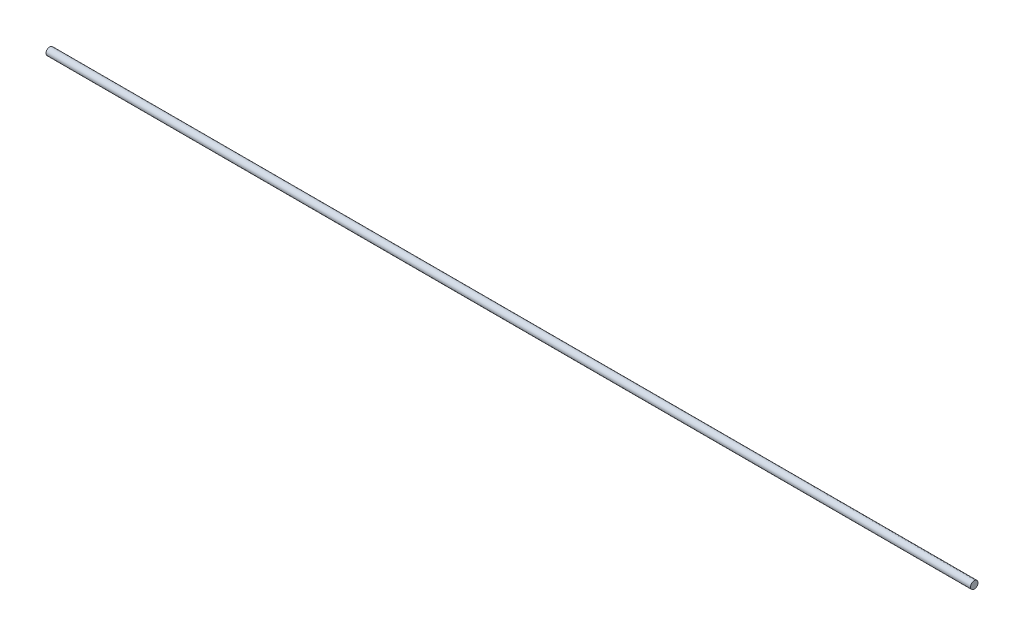
ISO-10303-21;
HEADER;
FILE_DESCRIPTION(('STEP AP214'),'2;1');
FILE_NAME('part.step','',(''),(''),'','','');
FILE_SCHEMA(('AUTOMOTIVE_DESIGN { 1 0 10303 214 1 1 1 1 }'));
ENDSEC;
DATA;
#1=APPLICATION_CONTEXT('core data for automotive mechanical design processes');
#2=APPLICATION_PROTOCOL_DEFINITION('international standard','automotive_design',2000,#1);
#3=PRODUCT_CONTEXT('',#1,'mechanical');
#4=PRODUCT('Part','Part','',(#3));
#5=PRODUCT_RELATED_PRODUCT_CATEGORY('part','',(#4));
#6=PRODUCT_DEFINITION_FORMATION('','',#4);
#7=PRODUCT_DEFINITION_CONTEXT('part definition',#1,'design');
#8=PRODUCT_DEFINITION('design','',#6,#7);
#9=PRODUCT_DEFINITION_SHAPE('','',#8);
#10=(LENGTH_UNIT() NAMED_UNIT(*) SI_UNIT(.MILLI.,.METRE.));
#11=(NAMED_UNIT(*) PLANE_ANGLE_UNIT() SI_UNIT($,.RADIAN.));
#12=(NAMED_UNIT(*) SI_UNIT($,.STERADIAN.) SOLID_ANGLE_UNIT());
#13=UNCERTAINTY_MEASURE_WITH_UNIT(LENGTH_MEASURE(1.E-05),#10,'distance_accuracy_value','');
#14=(GEOMETRIC_REPRESENTATION_CONTEXT(3) GLOBAL_UNCERTAINTY_ASSIGNED_CONTEXT((#13)) GLOBAL_UNIT_ASSIGNED_CONTEXT((#10,
#11,#12)) REPRESENTATION_CONTEXT('',''));
#15=CARTESIAN_POINT('',(0.,0.,0.));
#16=DIRECTION('',(0.,0.,1.));
#17=DIRECTION('',(1.,0.,0.));
#18=AXIS2_PLACEMENT_3D('',#15,#16,#17);
#19=CARTESIAN_POINT('',(-590.,0.,0.));
#20=DIRECTION('',(1.,0.,0.));
#21=DIRECTION('',(0.,0.,-1.));
#22=AXIS2_PLACEMENT_3D('',#19,#20,#21);
#23=PLANE('',#22);
#24=CARTESIAN_POINT('',(-590.,0.,0.));
#25=DIRECTION('',(1.,0.,0.));
#26=DIRECTION('',(0.,0.,-1.));
#27=AXIS2_PLACEMENT_3D('',#24,#25,#26);
#28=CIRCLE('',#27,4.7625);
#29=CARTESIAN_POINT('',(-590.,0.,-4.7625));
#30=VERTEX_POINT('',#29);
#31=EDGE_CURVE('E46',#30,#30,#28,.T.);
#32=ORIENTED_EDGE('',*,*,#31,.F.);
#33=EDGE_LOOP('',(#32));
#34=FACE_BOUND('',#33,.T.);
#35=ADVANCED_FACE('F39',(#34),#23,.F.);
#36=CARTESIAN_POINT('',(590.,0.,0.));
#37=DIRECTION('',(1.,0.,0.));
#38=DIRECTION('',(0.,0.,-1.));
#39=AXIS2_PLACEMENT_3D('',#36,#37,#38);
#40=PLANE('',#39);
#41=CARTESIAN_POINT('',(590.,0.,0.));
#42=DIRECTION('',(1.,0.,0.));
#43=DIRECTION('',(0.,0.,-1.));
#44=AXIS2_PLACEMENT_3D('',#41,#42,#43);
#45=CIRCLE('',#44,4.7625);
#46=CARTESIAN_POINT('',(590.,0.,-4.7625));
#47=VERTEX_POINT('',#46);
#48=EDGE_CURVE('E12',#47,#47,#45,.T.);
#49=ORIENTED_EDGE('',*,*,#48,.T.);
#50=EDGE_LOOP('',(#49));
#51=FACE_BOUND('',#50,.T.);
#52=ADVANCED_FACE('F53',(#51),#40,.T.);
#53=CARTESIAN_POINT('',(-590.,0.,0.));
#54=DIRECTION('',(1.,0.,0.));
#55=DIRECTION('',(0.,0.,-1.));
#56=AXIS2_PLACEMENT_3D('',#53,#54,#55);
#57=CYLINDRICAL_SURFACE('',#56,4.7625);
#58=ORIENTED_EDGE('',*,*,#48,.F.);
#59=EDGE_LOOP('',(#58));
#60=FACE_BOUND('',#59,.T.);
#61=ORIENTED_EDGE('',*,*,#31,.T.);
#62=EDGE_LOOP('',(#61));
#63=FACE_BOUND('',#62,.T.);
#64=ADVANCED_FACE('F55',(#60,#63),#57,.T.);
#65=CLOSED_SHELL('',(#35,#52,#64));
#66=MANIFOLD_SOLID_BREP('B2',#65);
#67=ADVANCED_BREP_SHAPE_REPRESENTATION('',(#18,#66),#14);
#68=SHAPE_DEFINITION_REPRESENTATION(#9,#67);
ENDSEC;
END-ISO-10303-21;
